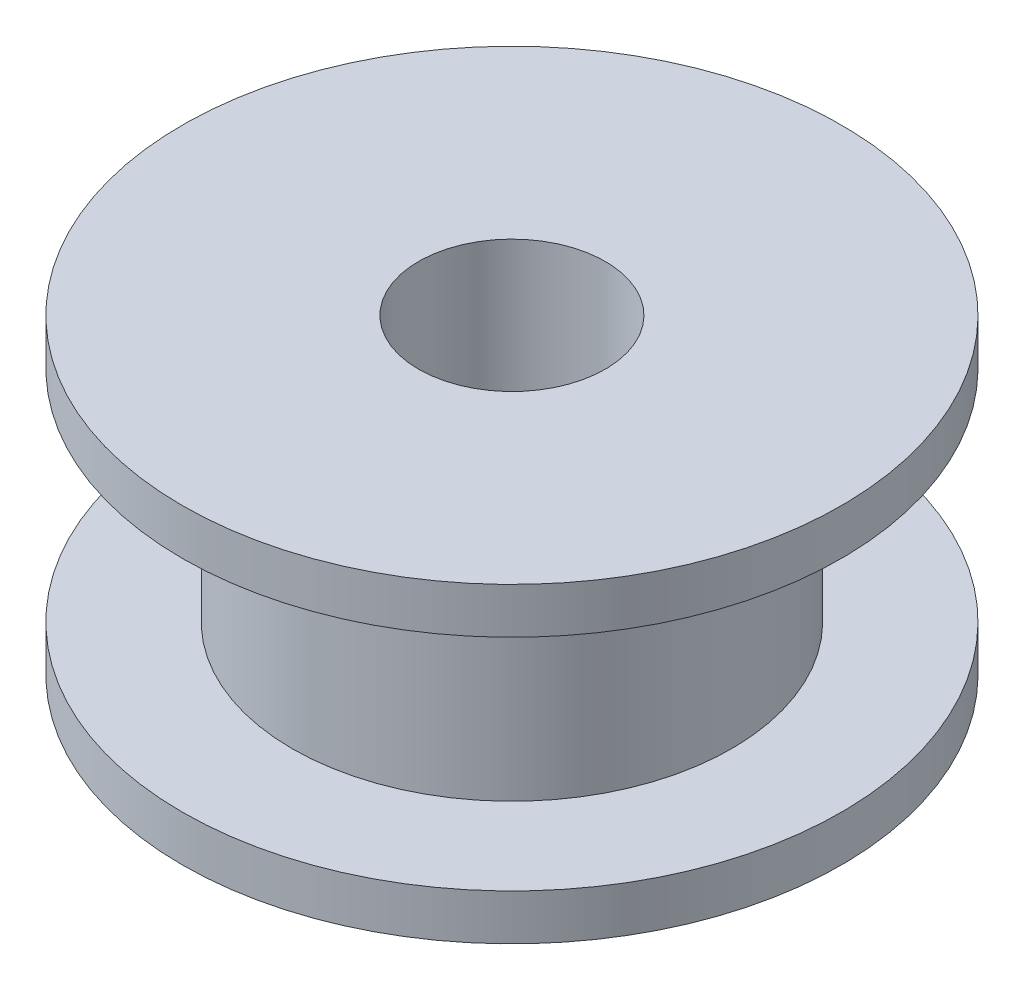
ISO-10303-21;
HEADER;
FILE_DESCRIPTION(('STEP AP214'),'2;1');
FILE_NAME('part.step','',(''),(''),'','','');
FILE_SCHEMA(('AUTOMOTIVE_DESIGN { 1 0 10303 214 1 1 1 1 }'));
ENDSEC;
DATA;
#1=APPLICATION_CONTEXT('core data for automotive mechanical design processes');
#2=APPLICATION_PROTOCOL_DEFINITION('international standard','automotive_design',2000,#1);
#3=PRODUCT_CONTEXT('',#1,'mechanical');
#4=PRODUCT('Part','Part','',(#3));
#5=PRODUCT_RELATED_PRODUCT_CATEGORY('part','',(#4));
#6=PRODUCT_DEFINITION_FORMATION('','',#4);
#7=PRODUCT_DEFINITION_CONTEXT('part definition',#1,'design');
#8=PRODUCT_DEFINITION('design','',#6,#7);
#9=PRODUCT_DEFINITION_SHAPE('','',#8);
#10=(LENGTH_UNIT() NAMED_UNIT(*) SI_UNIT(.MILLI.,.METRE.));
#11=(NAMED_UNIT(*) PLANE_ANGLE_UNIT() SI_UNIT($,.RADIAN.));
#12=(NAMED_UNIT(*) SI_UNIT($,.STERADIAN.) SOLID_ANGLE_UNIT());
#13=UNCERTAINTY_MEASURE_WITH_UNIT(LENGTH_MEASURE(1.E-05),#10,'distance_accuracy_value','');
#14=(GEOMETRIC_REPRESENTATION_CONTEXT(3) GLOBAL_UNCERTAINTY_ASSIGNED_CONTEXT((#13)) GLOBAL_UNIT_ASSIGNED_CONTEXT((#10,
#11,#12)) REPRESENTATION_CONTEXT('',''));
#15=CARTESIAN_POINT('',(0.,0.,0.));
#16=DIRECTION('',(0.,0.,1.));
#17=DIRECTION('',(1.,0.,0.));
#18=AXIS2_PLACEMENT_3D('',#15,#16,#17);
#19=CARTESIAN_POINT('',(0.,3.,0.));
#20=DIRECTION('',(0.,-1.,0.));
#21=DIRECTION('',(0.,0.,-1.));
#22=AXIS2_PLACEMENT_3D('',#19,#20,#21);
#23=CYLINDRICAL_SURFACE('',#22,6.);
#24=CARTESIAN_POINT('',(0.,3.,0.));
#25=DIRECTION('',(0.,1.,0.));
#26=DIRECTION('',(0.,0.,1.));
#27=AXIS2_PLACEMENT_3D('',#24,#25,#26);
#28=CIRCLE('',#27,6.);
#29=CARTESIAN_POINT('',(0.,3.,6.));
#30=VERTEX_POINT('',#29);
#31=EDGE_CURVE('E10',#30,#30,#28,.T.);
#32=ORIENTED_EDGE('',*,*,#31,.F.);
#33=EDGE_LOOP('',(#32));
#34=FACE_BOUND('',#33,.T.);
#35=CARTESIAN_POINT('',(0.,-3.,0.));
#36=DIRECTION('',(0.,1.,0.));
#37=DIRECTION('',(0.,0.,1.));
#38=AXIS2_PLACEMENT_3D('',#35,#36,#37);
#39=CIRCLE('',#38,6.);
#40=CARTESIAN_POINT('',(0.,-3.,6.));
#41=VERTEX_POINT('',#40);
#42=EDGE_CURVE('E44',#41,#41,#39,.T.);
#43=ORIENTED_EDGE('',*,*,#42,.T.);
#44=EDGE_LOOP('',(#43));
#45=FACE_BOUND('',#44,.T.);
#46=ADVANCED_FACE('F41',(#34,#45),#23,.T.);
#47=CARTESIAN_POINT('',(0.,4.25,0.));
#48=DIRECTION('',(0.,-1.,0.));
#49=DIRECTION('',(0.,0.,-1.));
#50=AXIS2_PLACEMENT_3D('',#47,#48,#49);
#51=CYLINDRICAL_SURFACE('',#50,9.);
#52=CARTESIAN_POINT('',(0.,4.25,0.));
#53=DIRECTION('',(0.,1.,0.));
#54=DIRECTION('',(0.,0.,1.));
#55=AXIS2_PLACEMENT_3D('',#52,#53,#54);
#56=CIRCLE('',#55,9.);
#57=CARTESIAN_POINT('',(0.,4.25,9.));
#58=VERTEX_POINT('',#57);
#59=EDGE_CURVE('E49',#58,#58,#56,.T.);
#60=ORIENTED_EDGE('',*,*,#59,.F.);
#61=EDGE_LOOP('',(#60));
#62=FACE_BOUND('',#61,.T.);
#63=CARTESIAN_POINT('',(0.,3.,0.));
#64=DIRECTION('',(0.,1.,0.));
#65=DIRECTION('',(0.,0.,1.));
#66=AXIS2_PLACEMENT_3D('',#63,#64,#65);
#67=CIRCLE('',#66,9.);
#68=CARTESIAN_POINT('',(0.,3.,9.));
#69=VERTEX_POINT('',#68);
#70=EDGE_CURVE('E54',#69,#69,#67,.T.);
#71=ORIENTED_EDGE('',*,*,#70,.T.);
#72=EDGE_LOOP('',(#71));
#73=FACE_BOUND('',#72,.T.);
#74=ADVANCED_FACE('F91',(#62,#73),#51,.T.);
#75=CARTESIAN_POINT('',(0.,4.25,0.));
#76=DIRECTION('',(0.,1.,0.));
#77=DIRECTION('',(0.,0.,1.));
#78=AXIS2_PLACEMENT_3D('',#75,#76,#77);
#79=PLANE('',#78);
#80=CARTESIAN_POINT('',(0.,4.25,0.));
#81=DIRECTION('',(0.,1.,0.));
#82=DIRECTION('',(0.,0.,1.));
#83=AXIS2_PLACEMENT_3D('',#80,#81,#82);
#84=CIRCLE('',#83,2.55);
#85=CARTESIAN_POINT('',(0.,4.25,2.55));
#86=VERTEX_POINT('',#85);
#87=EDGE_CURVE('E69',#86,#86,#84,.T.);
#88=ORIENTED_EDGE('',*,*,#87,.F.);
#89=EDGE_LOOP('',(#88));
#90=FACE_BOUND('',#89,.T.);
#91=ORIENTED_EDGE('',*,*,#59,.T.);
#92=EDGE_LOOP('',(#91));
#93=FACE_BOUND('',#92,.T.);
#94=ADVANCED_FACE('F87',(#90,#93),#79,.T.);
#95=CARTESIAN_POINT('',(0.,3.,0.));
#96=DIRECTION('',(0.,1.,0.));
#97=DIRECTION('',(0.,0.,1.));
#98=AXIS2_PLACEMENT_3D('',#95,#96,#97);
#99=PLANE('',#98);
#100=ORIENTED_EDGE('',*,*,#31,.T.);
#101=EDGE_LOOP('',(#100));
#102=FACE_BOUND('',#101,.T.);
#103=ORIENTED_EDGE('',*,*,#70,.F.);
#104=EDGE_LOOP('',(#103));
#105=FACE_BOUND('',#104,.T.);
#106=ADVANCED_FACE('F90',(#102,#105),#99,.F.);
#107=CARTESIAN_POINT('',(0.,-4.25,0.));
#108=DIRECTION('',(0.,1.,0.));
#109=DIRECTION('',(0.,0.,1.));
#110=AXIS2_PLACEMENT_3D('',#107,#108,#109);
#111=CYLINDRICAL_SURFACE('',#110,9.);
#112=CARTESIAN_POINT('',(0.,-4.25,0.));
#113=DIRECTION('',(0.,1.,0.));
#114=DIRECTION('',(0.,0.,1.));
#115=AXIS2_PLACEMENT_3D('',#112,#113,#114);
#116=CIRCLE('',#115,9.);
#117=CARTESIAN_POINT('',(0.,-4.25,9.));
#118=VERTEX_POINT('',#117);
#119=EDGE_CURVE('E64',#118,#118,#116,.T.);
#120=ORIENTED_EDGE('',*,*,#119,.T.);
#121=EDGE_LOOP('',(#120));
#122=FACE_BOUND('',#121,.T.);
#123=CARTESIAN_POINT('',(0.,-3.,0.));
#124=DIRECTION('',(0.,1.,0.));
#125=DIRECTION('',(0.,0.,1.));
#126=AXIS2_PLACEMENT_3D('',#123,#124,#125);
#127=CIRCLE('',#126,9.);
#128=CARTESIAN_POINT('',(0.,-3.,9.));
#129=VERTEX_POINT('',#128);
#130=EDGE_CURVE('E60',#129,#129,#127,.T.);
#131=ORIENTED_EDGE('',*,*,#130,.F.);
#132=EDGE_LOOP('',(#131));
#133=FACE_BOUND('',#132,.T.);
#134=ADVANCED_FACE('F100',(#122,#133),#111,.T.);
#135=CARTESIAN_POINT('',(0.,-4.25,0.));
#136=DIRECTION('',(0.,-1.,0.));
#137=DIRECTION('',(0.,0.,1.));
#138=AXIS2_PLACEMENT_3D('',#135,#136,#137);
#139=PLANE('',#138);
#140=CARTESIAN_POINT('',(0.,-4.25,0.));
#141=DIRECTION('',(0.,1.,0.));
#142=DIRECTION('',(0.,0.,1.));
#143=AXIS2_PLACEMENT_3D('',#140,#141,#142);
#144=CIRCLE('',#143,2.55);
#145=CARTESIAN_POINT('',(0.,-4.25,2.55));
#146=VERTEX_POINT('',#145);
#147=EDGE_CURVE('E65',#146,#146,#144,.T.);
#148=ORIENTED_EDGE('',*,*,#147,.T.);
#149=EDGE_LOOP('',(#148));
#150=FACE_BOUND('',#149,.T.);
#151=ORIENTED_EDGE('',*,*,#119,.F.);
#152=EDGE_LOOP('',(#151));
#153=FACE_BOUND('',#152,.T.);
#154=ADVANCED_FACE('F77',(#150,#153),#139,.T.);
#155=CARTESIAN_POINT('',(0.,-3.,0.));
#156=DIRECTION('',(0.,-1.,0.));
#157=DIRECTION('',(0.,0.,1.));
#158=AXIS2_PLACEMENT_3D('',#155,#156,#157);
#159=PLANE('',#158);
#160=ORIENTED_EDGE('',*,*,#42,.F.);
#161=EDGE_LOOP('',(#160));
#162=FACE_BOUND('',#161,.T.);
#163=ORIENTED_EDGE('',*,*,#130,.T.);
#164=EDGE_LOOP('',(#163));
#165=FACE_BOUND('',#164,.T.);
#166=ADVANCED_FACE('F83',(#162,#165),#159,.F.);
#167=CARTESIAN_POINT('',(0.,-4.25,0.));
#168=DIRECTION('',(0.,1.,0.));
#169=DIRECTION('',(0.,0.,1.));
#170=AXIS2_PLACEMENT_3D('',#167,#168,#169);
#171=CYLINDRICAL_SURFACE('',#170,2.55);
#172=ORIENTED_EDGE('',*,*,#147,.F.);
#173=EDGE_LOOP('',(#172));
#174=FACE_BOUND('',#173,.T.);
#175=ORIENTED_EDGE('',*,*,#87,.T.);
#176=EDGE_LOOP('',(#175));
#177=FACE_BOUND('',#176,.T.);
#178=ADVANCED_FACE('F80',(#174,#177),#171,.F.);
#179=CLOSED_SHELL('',(#46,#74,#94,#106,#134,#154,#166,#178));
#180=MANIFOLD_SOLID_BREP('B2',#179);
#181=ADVANCED_BREP_SHAPE_REPRESENTATION('',(#18,#180),#14);
#182=SHAPE_DEFINITION_REPRESENTATION(#9,#181);
ENDSEC;
END-ISO-10303-21;
